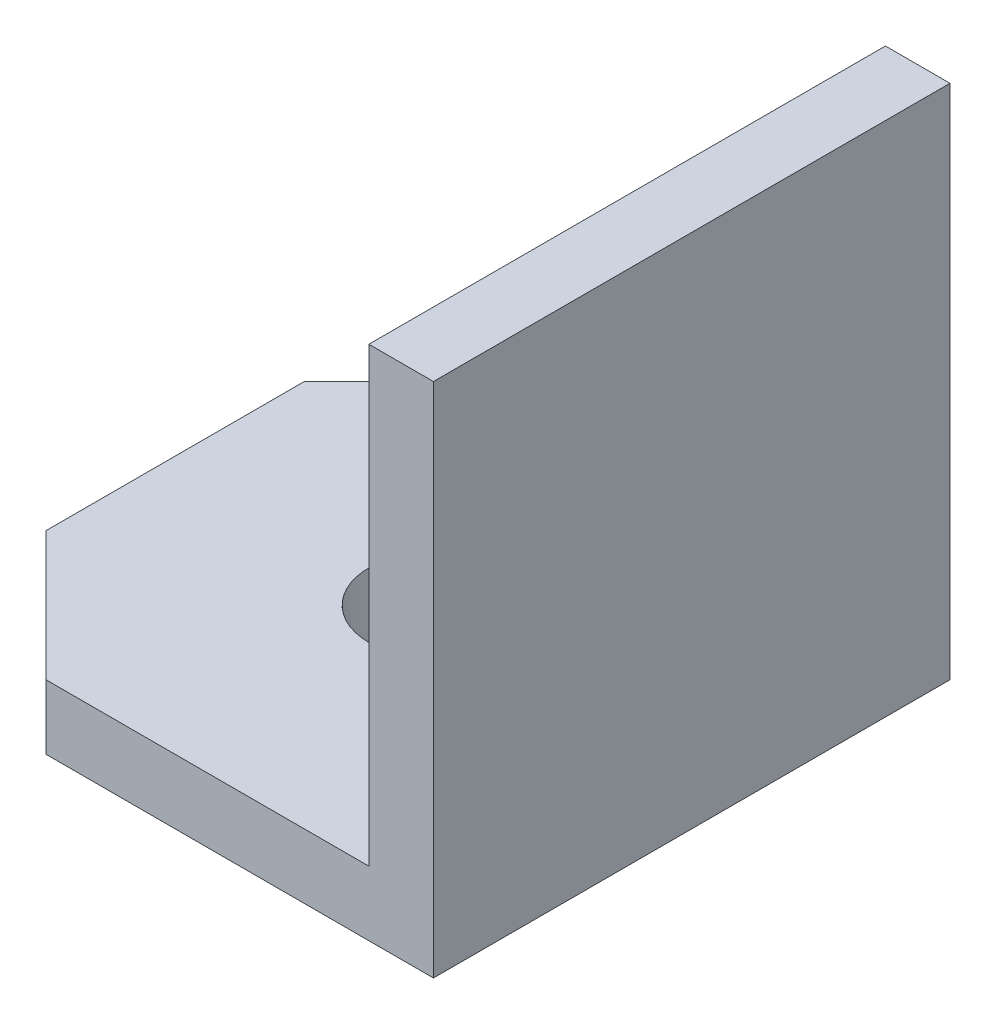
ISO-10303-21;
HEADER;
FILE_DESCRIPTION(('STEP AP214'),'2;1');
FILE_NAME('part.step','',(''),(''),'','','');
FILE_SCHEMA(('AUTOMOTIVE_DESIGN { 1 0 10303 214 1 1 1 1 }'));
ENDSEC;
DATA;
#1=APPLICATION_CONTEXT('core data for automotive mechanical design processes');
#2=APPLICATION_PROTOCOL_DEFINITION('international standard','automotive_design',2000,#1);
#3=PRODUCT_CONTEXT('',#1,'mechanical');
#4=PRODUCT('Part','Part','',(#3));
#5=PRODUCT_RELATED_PRODUCT_CATEGORY('part','',(#4));
#6=PRODUCT_DEFINITION_FORMATION('','',#4);
#7=PRODUCT_DEFINITION_CONTEXT('part definition',#1,'design');
#8=PRODUCT_DEFINITION('design','',#6,#7);
#9=PRODUCT_DEFINITION_SHAPE('','',#8);
#10=(LENGTH_UNIT() NAMED_UNIT(*) SI_UNIT(.MILLI.,.METRE.));
#11=(NAMED_UNIT(*) PLANE_ANGLE_UNIT() SI_UNIT($,.RADIAN.));
#12=(NAMED_UNIT(*) SI_UNIT($,.STERADIAN.) SOLID_ANGLE_UNIT());
#13=UNCERTAINTY_MEASURE_WITH_UNIT(LENGTH_MEASURE(1.E-05),#10,'distance_accuracy_value','');
#14=(GEOMETRIC_REPRESENTATION_CONTEXT(3) GLOBAL_UNCERTAINTY_ASSIGNED_CONTEXT((#13)) GLOBAL_UNIT_ASSIGNED_CONTEXT((#10,
#11,#12)) REPRESENTATION_CONTEXT('',''));
#15=CARTESIAN_POINT('',(0.,0.,0.));
#16=DIRECTION('',(0.,0.,1.));
#17=DIRECTION('',(1.,0.,0.));
#18=AXIS2_PLACEMENT_3D('',#15,#16,#17);
#19=CARTESIAN_POINT('',(0.,0.,40.));
#20=DIRECTION('',(-1.,0.,0.));
#21=DIRECTION('',(0.,0.,1.));
#22=AXIS2_PLACEMENT_3D('',#19,#20,#21);
#23=PLANE('',#22);
#24=DIRECTION('',(0.,1.,0.));
#25=VECTOR('',#24,1.);
#26=CARTESIAN_POINT('',(0.,0.,0.));
#27=LINE('',#26,#25);
#28=CARTESIAN_POINT('',(0.,0.,0.));
#29=VERTEX_POINT('',#28);
#30=CARTESIAN_POINT('',(0.,40.,0.));
#31=VERTEX_POINT('',#30);
#32=EDGE_CURVE('E116',#29,#31,#27,.T.);
#33=ORIENTED_EDGE('',*,*,#32,.T.);
#34=DIRECTION('',(0.,0.,-1.));
#35=VECTOR('',#34,1.);
#36=CARTESIAN_POINT('',(0.,40.,40.));
#37=LINE('',#36,#35);
#38=CARTESIAN_POINT('',(0.,40.,40.));
#39=VERTEX_POINT('',#38);
#40=EDGE_CURVE('E114',#39,#31,#37,.T.);
#41=ORIENTED_EDGE('',*,*,#40,.F.);
#42=DIRECTION('',(0.,1.,0.));
#43=VECTOR('',#42,1.);
#44=CARTESIAN_POINT('',(0.,0.,40.));
#45=LINE('',#44,#43);
#46=CARTESIAN_POINT('',(0.,0.,40.));
#47=VERTEX_POINT('',#46);
#48=EDGE_CURVE('E100',#47,#39,#45,.T.);
#49=ORIENTED_EDGE('',*,*,#48,.F.);
#50=DIRECTION('',(0.,0.,-1.));
#51=VECTOR('',#50,1.);
#52=CARTESIAN_POINT('',(0.,0.,40.));
#53=LINE('',#52,#51);
#54=EDGE_CURVE('E132',#47,#29,#53,.T.);
#55=ORIENTED_EDGE('',*,*,#54,.T.);
#56=EDGE_LOOP('',(#33,#41,#49,#55));
#57=FACE_BOUND('',#56,.T.);
#58=ADVANCED_FACE('F33',(#57),#23,.F.);
#59=CARTESIAN_POINT('',(-5.,40.,40.));
#60=DIRECTION('',(0.,1.,0.));
#61=DIRECTION('',(0.,0.,1.));
#62=AXIS2_PLACEMENT_3D('',#59,#60,#61);
#63=PLANE('',#62);
#64=DIRECTION('',(1.,0.,0.));
#65=VECTOR('',#64,1.);
#66=CARTESIAN_POINT('',(-5.,40.,0.));
#67=LINE('',#66,#65);
#68=CARTESIAN_POINT('',(-5.,40.,0.));
#69=VERTEX_POINT('',#68);
#70=EDGE_CURVE('E134',#69,#31,#67,.T.);
#71=ORIENTED_EDGE('',*,*,#70,.F.);
#72=DIRECTION('',(0.,0.,-1.));
#73=VECTOR('',#72,1.);
#74=CARTESIAN_POINT('',(-5.,40.,40.));
#75=LINE('',#74,#73);
#76=CARTESIAN_POINT('',(-5.,40.,40.));
#77=VERTEX_POINT('',#76);
#78=EDGE_CURVE('E121',#77,#69,#75,.T.);
#79=ORIENTED_EDGE('',*,*,#78,.F.);
#80=DIRECTION('',(1.,0.,0.));
#81=VECTOR('',#80,1.);
#82=CARTESIAN_POINT('',(-5.,40.,40.));
#83=LINE('',#82,#81);
#84=EDGE_CURVE('E105',#77,#39,#83,.T.);
#85=ORIENTED_EDGE('',*,*,#84,.T.);
#86=ORIENTED_EDGE('',*,*,#40,.T.);
#87=EDGE_LOOP('',(#71,#79,#85,#86));
#88=FACE_BOUND('',#87,.T.);
#89=ADVANCED_FACE('F123',(#88),#63,.T.);
#90=CARTESIAN_POINT('',(-5.,0.,40.));
#91=DIRECTION('',(-1.,0.,0.));
#92=DIRECTION('',(0.,0.,1.));
#93=AXIS2_PLACEMENT_3D('',#90,#91,#92);
#94=PLANE('',#93);
#95=DIRECTION('',(0.,1.,0.));
#96=VECTOR('',#95,1.);
#97=CARTESIAN_POINT('',(-5.,0.,0.));
#98=LINE('',#97,#96);
#99=CARTESIAN_POINT('',(-5.,5.,0.));
#100=VERTEX_POINT('',#99);
#101=EDGE_CURVE('E136',#100,#69,#98,.T.);
#102=ORIENTED_EDGE('',*,*,#101,.F.);
#103=DIRECTION('',(0.,0.,-1.));
#104=VECTOR('',#103,1.);
#105=CARTESIAN_POINT('',(-5.,5.,40.));
#106=LINE('',#105,#104);
#107=CARTESIAN_POINT('',(-5.,5.,40.));
#108=VERTEX_POINT('',#107);
#109=EDGE_CURVE('E148',#108,#100,#106,.T.);
#110=ORIENTED_EDGE('',*,*,#109,.F.);
#111=DIRECTION('',(0.,1.,0.));
#112=VECTOR('',#111,1.);
#113=CARTESIAN_POINT('',(-5.,0.,40.));
#114=LINE('',#113,#112);
#115=EDGE_CURVE('E124',#108,#77,#114,.T.);
#116=ORIENTED_EDGE('',*,*,#115,.T.);
#117=ORIENTED_EDGE('',*,*,#78,.T.);
#118=EDGE_LOOP('',(#102,#110,#116,#117));
#119=FACE_BOUND('',#118,.T.);
#120=ADVANCED_FACE('F177',(#119),#94,.T.);
#121=CARTESIAN_POINT('',(-40.,5.,40.));
#122=DIRECTION('',(0.,1.,0.));
#123=DIRECTION('',(0.,0.,1.));
#124=AXIS2_PLACEMENT_3D('',#121,#122,#123);
#125=PLANE('',#124);
#126=CARTESIAN_POINT('',(-20.,5.,20.));
#127=DIRECTION('',(0.,1.,0.));
#128=DIRECTION('',(0.,0.,1.));
#129=AXIS2_PLACEMENT_3D('',#126,#127,#128);
#130=CIRCLE('',#129,5.);
#131=CARTESIAN_POINT('',(-20.,5.,25.));
#132=VERTEX_POINT('',#131);
#133=EDGE_CURVE('E276',#132,#132,#130,.T.);
#134=ORIENTED_EDGE('',*,*,#133,.F.);
#135=EDGE_LOOP('',(#134));
#136=FACE_BOUND('',#135,.T.);
#137=DIRECTION('',(0.,0.,-1.));
#138=VECTOR('',#137,1.);
#139=CARTESIAN_POINT('',(-40.,5.,40.));
#140=LINE('',#139,#138);
#141=CARTESIAN_POINT('',(-40.,5.,30.));
#142=VERTEX_POINT('',#141);
#143=CARTESIAN_POINT('',(-40.,5.,10.));
#144=VERTEX_POINT('',#143);
#145=EDGE_CURVE('E145',#142,#144,#140,.T.);
#146=ORIENTED_EDGE('',*,*,#145,.F.);
#147=DIRECTION('',(0.707106781186549,0.,0.707106781186547));
#148=VECTOR('',#147,1.);
#149=CARTESIAN_POINT('',(-35.,5.,35.));
#150=LINE('',#149,#148);
#151=CARTESIAN_POINT('',(-30.,5.,40.));
#152=VERTEX_POINT('',#151);
#153=EDGE_CURVE('E158',#142,#152,#150,.T.);
#154=ORIENTED_EDGE('',*,*,#153,.T.);
#155=DIRECTION('',(1.,0.,0.));
#156=VECTOR('',#155,1.);
#157=CARTESIAN_POINT('',(-40.,5.,40.));
#158=LINE('',#157,#156);
#159=EDGE_CURVE('E126',#152,#108,#158,.T.);
#160=ORIENTED_EDGE('',*,*,#159,.T.);
#161=ORIENTED_EDGE('',*,*,#109,.T.);
#162=DIRECTION('',(1.,0.,0.));
#163=VECTOR('',#162,1.);
#164=CARTESIAN_POINT('',(-40.,5.,0.));
#165=LINE('',#164,#163);
#166=CARTESIAN_POINT('',(-30.,5.,0.));
#167=VERTEX_POINT('',#166);
#168=EDGE_CURVE('E139',#167,#100,#165,.T.);
#169=ORIENTED_EDGE('',*,*,#168,.F.);
#170=DIRECTION('',(0.707106781186547,0.,-0.707106781186549));
#171=VECTOR('',#170,1.);
#172=CARTESIAN_POINT('',(-55.,5.,25.0000000000001));
#173=LINE('',#172,#171);
#174=EDGE_CURVE('E156',#167,#144,#173,.F.);
#175=ORIENTED_EDGE('',*,*,#174,.T.);
#176=EDGE_LOOP('',(#146,#154,#160,#161,#169,#175));
#177=FACE_BOUND('',#176,.T.);
#178=ADVANCED_FACE('F173',(#136,#177),#125,.T.);
#179=CARTESIAN_POINT('',(-40.,0.,40.));
#180=DIRECTION('',(-1.,0.,0.));
#181=DIRECTION('',(0.,0.,1.));
#182=AXIS2_PLACEMENT_3D('',#179,#180,#181);
#183=PLANE('',#182);
#184=DIRECTION('',(0.,0.,-1.));
#185=VECTOR('',#184,1.);
#186=CARTESIAN_POINT('',(-40.,0.,40.));
#187=LINE('',#186,#185);
#188=CARTESIAN_POINT('',(-40.,0.,30.));
#189=VERTEX_POINT('',#188);
#190=CARTESIAN_POINT('',(-40.,0.,10.));
#191=VERTEX_POINT('',#190);
#192=EDGE_CURVE('E143',#189,#191,#187,.T.);
#193=ORIENTED_EDGE('',*,*,#192,.F.);
#194=DIRECTION('',(0.,1.,0.));
#195=VECTOR('',#194,1.);
#196=CARTESIAN_POINT('',(-40.,5.,30.));
#197=LINE('',#196,#195);
#198=EDGE_CURVE('E153',#189,#142,#197,.T.);
#199=ORIENTED_EDGE('',*,*,#198,.T.);
#200=ORIENTED_EDGE('',*,*,#145,.T.);
#201=DIRECTION('',(0.,-1.,0.));
#202=VECTOR('',#201,1.);
#203=CARTESIAN_POINT('',(-40.,0.,10.));
#204=LINE('',#203,#202);
#205=EDGE_CURVE('E120',#144,#191,#204,.T.);
#206=ORIENTED_EDGE('',*,*,#205,.T.);
#207=EDGE_LOOP('',(#193,#199,#200,#206));
#208=FACE_BOUND('',#207,.T.);
#209=ADVANCED_FACE('F168',(#208),#183,.T.);
#210=CARTESIAN_POINT('',(-40.,0.,40.));
#211=DIRECTION('',(0.,1.,0.));
#212=DIRECTION('',(0.,0.,1.));
#213=AXIS2_PLACEMENT_3D('',#210,#211,#212);
#214=PLANE('',#213);
#215=CARTESIAN_POINT('',(-20.,0.,20.));
#216=DIRECTION('',(0.,1.,0.));
#217=DIRECTION('',(0.,0.,1.));
#218=AXIS2_PLACEMENT_3D('',#215,#216,#217);
#219=CIRCLE('',#218,5.);
#220=CARTESIAN_POINT('',(-20.,0.,25.));
#221=VERTEX_POINT('',#220);
#222=EDGE_CURVE('E37',#221,#221,#219,.T.);
#223=ORIENTED_EDGE('',*,*,#222,.T.);
#224=EDGE_LOOP('',(#223));
#225=FACE_BOUND('',#224,.T.);
#226=DIRECTION('',(1.,0.,0.));
#227=VECTOR('',#226,1.);
#228=CARTESIAN_POINT('',(-40.,0.,40.));
#229=LINE('',#228,#227);
#230=CARTESIAN_POINT('',(-30.,0.,40.));
#231=VERTEX_POINT('',#230);
#232=EDGE_CURVE('E107',#231,#47,#229,.T.);
#233=ORIENTED_EDGE('',*,*,#232,.F.);
#234=DIRECTION('',(-0.707106781186549,0.,-0.707106781186547));
#235=VECTOR('',#234,1.);
#236=CARTESIAN_POINT('',(-40.,0.,30.));
#237=LINE('',#236,#235);
#238=EDGE_CURVE('E42',#231,#189,#237,.T.);
#239=ORIENTED_EDGE('',*,*,#238,.T.);
#240=ORIENTED_EDGE('',*,*,#192,.T.);
#241=DIRECTION('',(-0.707106781186547,0.,0.707106781186549));
#242=VECTOR('',#241,1.);
#243=CARTESIAN_POINT('',(-30.,0.,0.));
#244=LINE('',#243,#242);
#245=CARTESIAN_POINT('',(-30.,0.,0.));
#246=VERTEX_POINT('',#245);
#247=EDGE_CURVE('E49',#191,#246,#244,.F.);
#248=ORIENTED_EDGE('',*,*,#247,.T.);
#249=DIRECTION('',(1.,0.,0.));
#250=VECTOR('',#249,1.);
#251=CARTESIAN_POINT('',(-40.,0.,0.));
#252=LINE('',#251,#250);
#253=EDGE_CURVE('E111',#246,#29,#252,.T.);
#254=ORIENTED_EDGE('',*,*,#253,.T.);
#255=ORIENTED_EDGE('',*,*,#54,.F.);
#256=EDGE_LOOP('',(#233,#239,#240,#248,#254,#255));
#257=FACE_BOUND('',#256,.T.);
#258=ADVANCED_FACE('F164',(#225,#257),#214,.F.);
#259=CARTESIAN_POINT('',(0.,0.,40.));
#260=DIRECTION('',(0.,0.,-1.));
#261=DIRECTION('',(-1.,0.,0.));
#262=AXIS2_PLACEMENT_3D('',#259,#260,#261);
#263=PLANE('',#262);
#264=ORIENTED_EDGE('',*,*,#159,.F.);
#265=DIRECTION('',(0.,-1.,0.));
#266=VECTOR('',#265,1.);
#267=CARTESIAN_POINT('',(-30.,0.,40.));
#268=LINE('',#267,#266);
#269=EDGE_CURVE('E57',#152,#231,#268,.T.);
#270=ORIENTED_EDGE('',*,*,#269,.T.);
#271=ORIENTED_EDGE('',*,*,#232,.T.);
#272=ORIENTED_EDGE('',*,*,#48,.T.);
#273=ORIENTED_EDGE('',*,*,#84,.F.);
#274=ORIENTED_EDGE('',*,*,#115,.F.);
#275=EDGE_LOOP('',(#264,#270,#271,#272,#273,#274));
#276=FACE_BOUND('',#275,.T.);
#277=ADVANCED_FACE('F102',(#276),#263,.F.);
#278=CARTESIAN_POINT('',(0.,0.,0.));
#279=DIRECTION('',(0.,0.,-1.));
#280=DIRECTION('',(-1.,0.,0.));
#281=AXIS2_PLACEMENT_3D('',#278,#279,#280);
#282=PLANE('',#281);
#283=ORIENTED_EDGE('',*,*,#253,.F.);
#284=DIRECTION('',(0.,1.,0.));
#285=VECTOR('',#284,1.);
#286=CARTESIAN_POINT('',(-30.,0.,0.));
#287=LINE('',#286,#285);
#288=EDGE_CURVE('E11',#246,#167,#287,.T.);
#289=ORIENTED_EDGE('',*,*,#288,.T.);
#290=ORIENTED_EDGE('',*,*,#168,.T.);
#291=ORIENTED_EDGE('',*,*,#101,.T.);
#292=ORIENTED_EDGE('',*,*,#70,.T.);
#293=ORIENTED_EDGE('',*,*,#32,.F.);
#294=EDGE_LOOP('',(#283,#289,#290,#291,#292,#293));
#295=FACE_BOUND('',#294,.T.);
#296=ADVANCED_FACE('F180',(#295),#282,.T.);
#297=CARTESIAN_POINT('',(-40.,0.,30.));
#298=DIRECTION('',(-0.707106781186547,0.,0.707106781186549));
#299=DIRECTION('',(0.,-1.,0.));
#300=AXIS2_PLACEMENT_3D('',#297,#298,#299);
#301=PLANE('',#300);
#302=ORIENTED_EDGE('',*,*,#238,.F.);
#303=ORIENTED_EDGE('',*,*,#269,.F.);
#304=ORIENTED_EDGE('',*,*,#153,.F.);
#305=ORIENTED_EDGE('',*,*,#198,.F.);
#306=EDGE_LOOP('',(#302,#303,#304,#305));
#307=FACE_BOUND('',#306,.T.);
#308=ADVANCED_FACE('F171',(#307),#301,.T.);
#309=CARTESIAN_POINT('',(-30.,0.,0.));
#310=DIRECTION('',(0.707106781186549,0.,0.707106781186547));
#311=DIRECTION('',(0.,1.,0.));
#312=AXIS2_PLACEMENT_3D('',#309,#310,#311);
#313=PLANE('',#312);
#314=ORIENTED_EDGE('',*,*,#247,.F.);
#315=ORIENTED_EDGE('',*,*,#205,.F.);
#316=ORIENTED_EDGE('',*,*,#174,.F.);
#317=ORIENTED_EDGE('',*,*,#288,.F.);
#318=EDGE_LOOP('',(#314,#315,#316,#317));
#319=FACE_BOUND('',#318,.T.);
#320=ADVANCED_FACE('F35',(#319),#313,.F.);
#321=CARTESIAN_POINT('',(-20.,-5.,20.));
#322=DIRECTION('',(0.,1.,0.));
#323=DIRECTION('',(0.,0.,1.));
#324=AXIS2_PLACEMENT_3D('',#321,#322,#323);
#325=CYLINDRICAL_SURFACE('',#324,5.);
#326=ORIENTED_EDGE('',*,*,#133,.T.);
#327=EDGE_LOOP('',(#326));
#328=FACE_BOUND('',#327,.T.);
#329=ORIENTED_EDGE('',*,*,#222,.F.);
#330=EDGE_LOOP('',(#329));
#331=FACE_BOUND('',#330,.T.);
#332=ADVANCED_FACE('F184',(#328,#331),#325,.F.);
#333=CLOSED_SHELL('',(#58,#89,#120,#178,#209,#258,#277,#296,#308,#320,#332));
#334=MANIFOLD_SOLID_BREP('B2',#333);
#335=ADVANCED_BREP_SHAPE_REPRESENTATION('',(#18,#334),#14);
#336=SHAPE_DEFINITION_REPRESENTATION(#9,#335);
ENDSEC;
END-ISO-10303-21;
